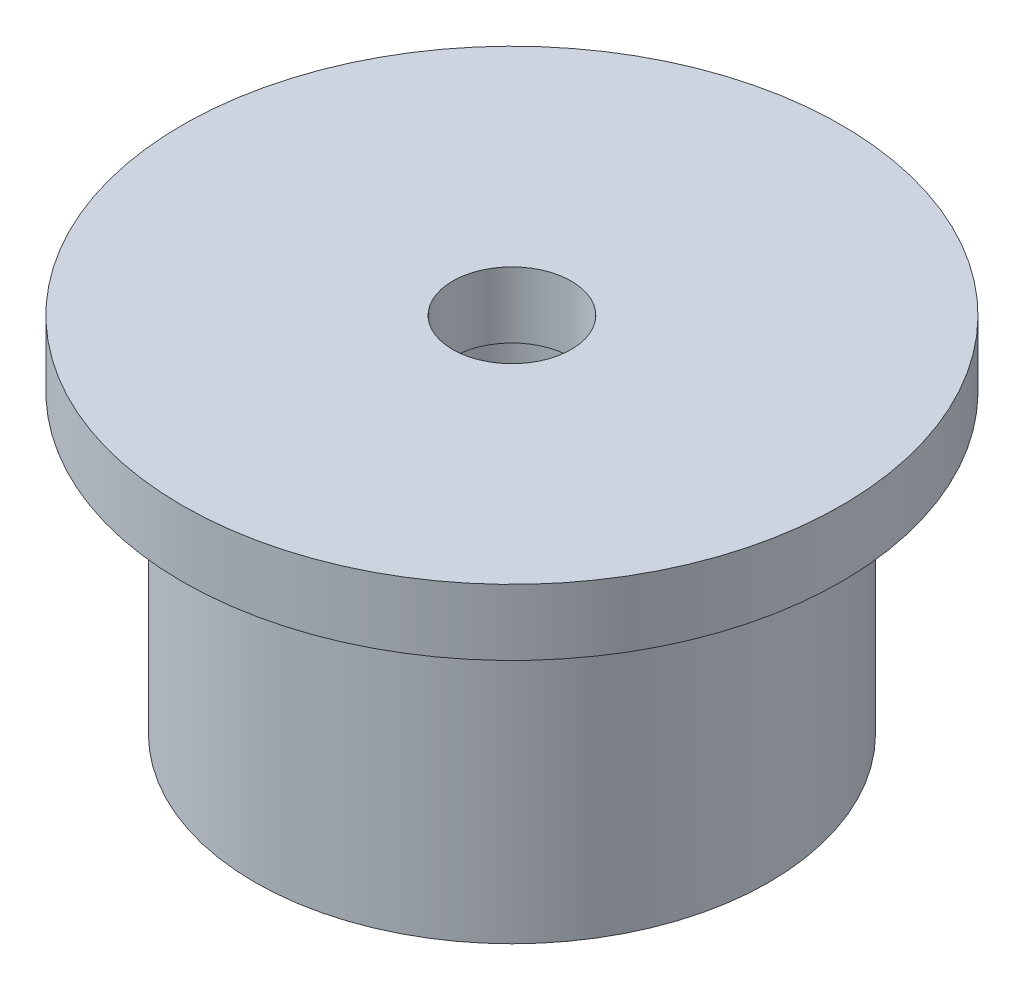
ISO-10303-21;
HEADER;
FILE_DESCRIPTION(('STEP AP214'),'2;1');
FILE_NAME('part.step','',(''),(''),'','','');
FILE_SCHEMA(('AUTOMOTIVE_DESIGN { 1 0 10303 214 1 1 1 1 }'));
ENDSEC;
DATA;
#1=APPLICATION_CONTEXT('core data for automotive mechanical design processes');
#2=APPLICATION_PROTOCOL_DEFINITION('international standard','automotive_design',2000,#1);
#3=PRODUCT_CONTEXT('',#1,'mechanical');
#4=PRODUCT('Part','Part','',(#3));
#5=PRODUCT_RELATED_PRODUCT_CATEGORY('part','',(#4));
#6=PRODUCT_DEFINITION_FORMATION('','',#4);
#7=PRODUCT_DEFINITION_CONTEXT('part definition',#1,'design');
#8=PRODUCT_DEFINITION('design','',#6,#7);
#9=PRODUCT_DEFINITION_SHAPE('','',#8);
#10=(LENGTH_UNIT() NAMED_UNIT(*) SI_UNIT(.MILLI.,.METRE.));
#11=(NAMED_UNIT(*) PLANE_ANGLE_UNIT() SI_UNIT($,.RADIAN.));
#12=(NAMED_UNIT(*) SI_UNIT($,.STERADIAN.) SOLID_ANGLE_UNIT());
#13=UNCERTAINTY_MEASURE_WITH_UNIT(LENGTH_MEASURE(1.E-05),#10,'distance_accuracy_value','');
#14=(GEOMETRIC_REPRESENTATION_CONTEXT(3) GLOBAL_UNCERTAINTY_ASSIGNED_CONTEXT((#13)) GLOBAL_UNIT_ASSIGNED_CONTEXT((#10,
#11,#12)) REPRESENTATION_CONTEXT('',''));
#15=CARTESIAN_POINT('',(0.,0.,0.));
#16=DIRECTION('',(0.,0.,1.));
#17=DIRECTION('',(1.,0.,0.));
#18=AXIS2_PLACEMENT_3D('',#15,#16,#17);
#19=CARTESIAN_POINT('',(0.,-0.5,0.));
#20=DIRECTION('',(0.,1.,0.));
#21=DIRECTION('',(0.,0.,1.));
#22=AXIS2_PLACEMENT_3D('',#19,#20,#21);
#23=PLANE('',#22);
#24=CARTESIAN_POINT('',(0.,-0.5,0.));
#25=DIRECTION('',(0.,1.,0.));
#26=DIRECTION('',(0.,0.,1.));
#27=AXIS2_PLACEMENT_3D('',#24,#25,#26);
#28=CIRCLE('',#27,5.);
#29=CARTESIAN_POINT('',(0.,-0.5,5.));
#30=VERTEX_POINT('',#29);
#31=EDGE_CURVE('E53',#30,#30,#28,.T.);
#32=ORIENTED_EDGE('',*,*,#31,.F.);
#33=EDGE_LOOP('',(#32));
#34=FACE_BOUND('',#33,.T.);
#35=CARTESIAN_POINT('',(0.,-0.5,0.));
#36=DIRECTION('',(0.,1.,0.));
#37=DIRECTION('',(0.,0.,1.));
#38=AXIS2_PLACEMENT_3D('',#35,#36,#37);
#39=CIRCLE('',#38,3.9);
#40=CARTESIAN_POINT('',(0.,-0.5,3.9));
#41=VERTEX_POINT('',#40);
#42=EDGE_CURVE('E46',#41,#41,#39,.F.);
#43=ORIENTED_EDGE('',*,*,#42,.F.);
#44=EDGE_LOOP('',(#43));
#45=FACE_BOUND('',#44,.T.);
#46=ADVANCED_FACE('F35',(#34,#45),#23,.F.);
#47=CARTESIAN_POINT('',(0.,0.5,0.));
#48=DIRECTION('',(0.,-1.,0.));
#49=DIRECTION('',(0.,0.,-1.));
#50=AXIS2_PLACEMENT_3D('',#47,#48,#49);
#51=CYLINDRICAL_SURFACE('',#50,5.);
#52=CARTESIAN_POINT('',(0.,0.5,0.));
#53=DIRECTION('',(0.,1.,0.));
#54=DIRECTION('',(0.,0.,1.));
#55=AXIS2_PLACEMENT_3D('',#52,#53,#54);
#56=CIRCLE('',#55,5.);
#57=CARTESIAN_POINT('',(0.,0.5,5.));
#58=VERTEX_POINT('',#57);
#59=EDGE_CURVE('E50',#58,#58,#56,.T.);
#60=ORIENTED_EDGE('',*,*,#59,.F.);
#61=EDGE_LOOP('',(#60));
#62=FACE_BOUND('',#61,.T.);
#63=ORIENTED_EDGE('',*,*,#31,.T.);
#64=EDGE_LOOP('',(#63));
#65=FACE_BOUND('',#64,.T.);
#66=ADVANCED_FACE('F77',(#62,#65),#51,.T.);
#67=CARTESIAN_POINT('',(0.,0.5,0.));
#68=DIRECTION('',(0.,1.,0.));
#69=DIRECTION('',(0.,0.,1.));
#70=AXIS2_PLACEMENT_3D('',#67,#68,#69);
#71=PLANE('',#70);
#72=CARTESIAN_POINT('',(0.,0.5,0.));
#73=DIRECTION('',(0.,1.,0.));
#74=DIRECTION('',(0.,0.,1.));
#75=AXIS2_PLACEMENT_3D('',#72,#73,#74);
#76=CIRCLE('',#75,0.9);
#77=CARTESIAN_POINT('',(0.,0.5,0.9));
#78=VERTEX_POINT('',#77);
#79=EDGE_CURVE('E64',#78,#78,#76,.T.);
#80=ORIENTED_EDGE('',*,*,#79,.F.);
#81=EDGE_LOOP('',(#80));
#82=FACE_BOUND('',#81,.T.);
#83=ORIENTED_EDGE('',*,*,#59,.T.);
#84=EDGE_LOOP('',(#83));
#85=FACE_BOUND('',#84,.T.);
#86=ADVANCED_FACE('F73',(#82,#85),#71,.T.);
#87=CARTESIAN_POINT('',(0.,-5.,0.));
#88=DIRECTION('',(0.,1.,0.));
#89=DIRECTION('',(0.,0.,1.));
#90=AXIS2_PLACEMENT_3D('',#87,#88,#89);
#91=CYLINDRICAL_SURFACE('',#90,3.9);
#92=CARTESIAN_POINT('',(0.,-5.,0.));
#93=DIRECTION('',(0.,-1.,0.));
#94=DIRECTION('',(0.,0.,-1.));
#95=AXIS2_PLACEMENT_3D('',#92,#93,#94);
#96=CIRCLE('',#95,3.9);
#97=CARTESIAN_POINT('',(0.,-5.,-3.9));
#98=VERTEX_POINT('',#97);
#99=EDGE_CURVE('E56',#98,#98,#96,.T.);
#100=ORIENTED_EDGE('',*,*,#99,.F.);
#101=EDGE_LOOP('',(#100));
#102=FACE_BOUND('',#101,.T.);
#103=ORIENTED_EDGE('',*,*,#42,.T.);
#104=EDGE_LOOP('',(#103));
#105=FACE_BOUND('',#104,.T.);
#106=ADVANCED_FACE('F76',(#102,#105),#91,.T.);
#107=CARTESIAN_POINT('',(0.,-5.,0.));
#108=DIRECTION('',(0.,-1.,0.));
#109=DIRECTION('',(0.,0.,-1.));
#110=AXIS2_PLACEMENT_3D('',#107,#108,#109);
#111=PLANE('',#110);
#112=CARTESIAN_POINT('',(0.,-5.,0.));
#113=DIRECTION('',(0.,-1.,0.));
#114=DIRECTION('',(0.,0.,-1.));
#115=AXIS2_PLACEMENT_3D('',#112,#113,#114);
#116=CIRCLE('',#115,1.2);
#117=CARTESIAN_POINT('',(0.,-5.,-1.2));
#118=VERTEX_POINT('',#117);
#119=EDGE_CURVE('E10',#118,#118,#116,.F.);
#120=ORIENTED_EDGE('',*,*,#119,.T.);
#121=EDGE_LOOP('',(#120));
#122=FACE_BOUND('',#121,.T.);
#123=ORIENTED_EDGE('',*,*,#99,.T.);
#124=EDGE_LOOP('',(#123));
#125=FACE_BOUND('',#124,.T.);
#126=ADVANCED_FACE('F91',(#122,#125),#111,.T.);
#127=CARTESIAN_POINT('',(0.,-0.5,0.));
#128=DIRECTION('',(0.,-1.,0.));
#129=DIRECTION('',(0.,0.,-1.));
#130=AXIS2_PLACEMENT_3D('',#127,#128,#129);
#131=CYLINDRICAL_SURFACE('',#130,1.);
#132=CARTESIAN_POINT('',(0.,-4.8,0.));
#133=DIRECTION('',(0.,-1.,0.));
#134=DIRECTION('',(0.,0.,-1.));
#135=AXIS2_PLACEMENT_3D('',#132,#133,#134);
#136=CIRCLE('',#135,1.);
#137=CARTESIAN_POINT('',(0.,-4.8,-1.));
#138=VERTEX_POINT('',#137);
#139=EDGE_CURVE('E42',#138,#138,#136,.T.);
#140=ORIENTED_EDGE('',*,*,#139,.T.);
#141=EDGE_LOOP('',(#140));
#142=FACE_BOUND('',#141,.T.);
#143=CARTESIAN_POINT('',(0.,-0.5,0.));
#144=DIRECTION('',(0.,-1.,0.));
#145=DIRECTION('',(0.,0.,-1.));
#146=AXIS2_PLACEMENT_3D('',#143,#144,#145);
#147=CIRCLE('',#146,1.);
#148=CARTESIAN_POINT('',(0.,-0.5,-1.));
#149=VERTEX_POINT('',#148);
#150=EDGE_CURVE('E61',#149,#149,#147,.T.);
#151=ORIENTED_EDGE('',*,*,#150,.F.);
#152=EDGE_LOOP('',(#151));
#153=FACE_BOUND('',#152,.T.);
#154=ADVANCED_FACE('F97',(#142,#153),#131,.F.);
#155=CARTESIAN_POINT('',(0.,-0.5,0.));
#156=DIRECTION('',(0.,-1.,0.));
#157=DIRECTION('',(0.,0.,-1.));
#158=AXIS2_PLACEMENT_3D('',#155,#156,#157);
#159=PLANE('',#158);
#160=CARTESIAN_POINT('',(0.,-0.5,0.));
#161=DIRECTION('',(0.,-1.,0.));
#162=DIRECTION('',(0.,0.,-1.));
#163=AXIS2_PLACEMENT_3D('',#160,#161,#162);
#164=CIRCLE('',#163,0.9);
#165=CARTESIAN_POINT('',(0.,-0.5,0.9));
#166=VERTEX_POINT('',#165);
#167=EDGE_CURVE('E65',#166,#166,#164,.F.);
#168=ORIENTED_EDGE('',*,*,#167,.T.);
#169=EDGE_LOOP('',(#168));
#170=FACE_BOUND('',#169,.T.);
#171=ORIENTED_EDGE('',*,*,#150,.T.);
#172=EDGE_LOOP('',(#171));
#173=FACE_BOUND('',#172,.T.);
#174=ADVANCED_FACE('F103',(#170,#173),#159,.T.);
#175=CARTESIAN_POINT('',(0.,-5.001,0.));
#176=DIRECTION('',(0.,1.,0.));
#177=DIRECTION('',(0.,0.,1.));
#178=AXIS2_PLACEMENT_3D('',#175,#176,#177);
#179=CYLINDRICAL_SURFACE('',#178,0.9);
#180=CARTESIAN_POINT('',(0.,-0.5,0.9));
#181=CARTESIAN_POINT('',(0.,-0.489583333333333,0.9));
#182=CARTESIAN_POINT('',(0.,-0.479166666666666,0.9));
#183=CARTESIAN_POINT('',(0.,-0.458333333333333,0.9));
#184=CARTESIAN_POINT('',(0.,-0.447916666666666,0.9));
#185=CARTESIAN_POINT('',(0.,-0.427083333333333,0.9));
#186=CARTESIAN_POINT('',(0.,-0.416666666666666,0.9));
#187=CARTESIAN_POINT('',(0.,-0.395833333333333,0.9));
#188=CARTESIAN_POINT('',(0.,-0.385416666666666,0.9));
#189=CARTESIAN_POINT('',(0.,-0.364583333333333,0.9));
#190=CARTESIAN_POINT('',(0.,-0.354166666666666,0.9));
#191=CARTESIAN_POINT('',(0.,-0.333333333333333,0.9));
#192=CARTESIAN_POINT('',(0.,-0.322916666666666,0.9));
#193=CARTESIAN_POINT('',(0.,-0.302083333333333,0.9));
#194=CARTESIAN_POINT('',(0.,-0.291666666666666,0.9));
#195=CARTESIAN_POINT('',(0.,-0.270833333333333,0.9));
#196=CARTESIAN_POINT('',(0.,-0.260416666666666,0.9));
#197=CARTESIAN_POINT('',(0.,-0.239583333333333,0.9));
#198=CARTESIAN_POINT('',(0.,-0.229166666666667,0.9));
#199=CARTESIAN_POINT('',(0.,-0.208333333333334,0.9));
#200=CARTESIAN_POINT('',(0.,-0.197916666666667,0.9));
#201=CARTESIAN_POINT('',(0.,-0.177083333333333,0.9));
#202=CARTESIAN_POINT('',(0.,-0.166666666666667,0.9));
#203=CARTESIAN_POINT('',(0.,-0.145833333333333,0.9));
#204=CARTESIAN_POINT('',(0.,-0.135416666666667,0.9));
#205=CARTESIAN_POINT('',(0.,-0.114583333333333,0.9));
#206=CARTESIAN_POINT('',(0.,-0.104166666666667,0.9));
#207=CARTESIAN_POINT('',(0.,-0.0833333333333334,0.9));
#208=CARTESIAN_POINT('',(0.,-0.0729166666666667,0.9));
#209=CARTESIAN_POINT('',(0.,-0.0520833333333334,0.9));
#210=CARTESIAN_POINT('',(0.,-0.0416666666666667,0.9));
#211=CARTESIAN_POINT('',(0.,-0.0208333333333334,0.9));
#212=CARTESIAN_POINT('',(0.,-0.0104166666666667,0.9));
#213=CARTESIAN_POINT('',(0.,0.0104166666666667,0.9));
#214=CARTESIAN_POINT('',(0.,0.0208333333333334,0.9));
#215=CARTESIAN_POINT('',(0.,0.0416666666666667,0.9));
#216=CARTESIAN_POINT('',(0.,0.0520833333333334,0.9));
#217=CARTESIAN_POINT('',(0.,0.0729166666666667,0.9));
#218=CARTESIAN_POINT('',(0.,0.0833333333333334,0.9));
#219=CARTESIAN_POINT('',(0.,0.104166666666667,0.9));
#220=CARTESIAN_POINT('',(0.,0.114583333333333,0.9));
#221=CARTESIAN_POINT('',(0.,0.135416666666667,0.9));
#222=CARTESIAN_POINT('',(0.,0.145833333333333,0.9));
#223=CARTESIAN_POINT('',(0.,0.166666666666667,0.9));
#224=CARTESIAN_POINT('',(0.,0.177083333333333,0.9));
#225=CARTESIAN_POINT('',(0.,0.197916666666667,0.9));
#226=CARTESIAN_POINT('',(0.,0.208333333333333,0.9));
#227=CARTESIAN_POINT('',(0.,0.229166666666666,0.9));
#228=CARTESIAN_POINT('',(0.,0.239583333333333,0.9));
#229=CARTESIAN_POINT('',(0.,0.260416666666666,0.9));
#230=CARTESIAN_POINT('',(0.,0.270833333333333,0.9));
#231=CARTESIAN_POINT('',(0.,0.291666666666666,0.9));
#232=CARTESIAN_POINT('',(0.,0.302083333333333,0.9));
#233=CARTESIAN_POINT('',(0.,0.322916666666666,0.9));
#234=CARTESIAN_POINT('',(0.,0.333333333333333,0.9));
#235=CARTESIAN_POINT('',(0.,0.354166666666666,0.9));
#236=CARTESIAN_POINT('',(0.,0.364583333333333,0.9));
#237=CARTESIAN_POINT('',(0.,0.385416666666666,0.9));
#238=CARTESIAN_POINT('',(0.,0.395833333333333,0.9));
#239=CARTESIAN_POINT('',(0.,0.416666666666666,0.9));
#240=CARTESIAN_POINT('',(0.,0.427083333333333,0.9));
#241=CARTESIAN_POINT('',(0.,0.447916666666666,0.9));
#242=CARTESIAN_POINT('',(0.,0.458333333333333,0.9));
#243=CARTESIAN_POINT('',(0.,0.479166666666666,0.9));
#244=CARTESIAN_POINT('',(0.,0.489583333333333,0.9));
#245=CARTESIAN_POINT('',(0.,0.5,0.9));
#246=B_SPLINE_CURVE_WITH_KNOTS('',3,(#180,#181,#182,#183,#184,#185,#186,#187,#188,#189,#190,
#191,#192,#193,#194,#195,#196,#197,#198,#199,#200,#201,#202,#203,#204,#205,#206,#207,#208,#209,
#210,#211,#212,#213,#214,#215,#216,#217,#218,#219,#220,#221,#222,#223,#224,#225,#226,#227,#228,
#229,#230,#231,#232,#233,#234,#235,#236,#237,#238,#239,#240,#241,#242,#243,#244,#245),
.UNSPECIFIED.,.F.,.F.,(4,2,2,2,2,2,2,2,2,2,2,2,2,2,2,2,2,2,2,2,2,2,2,2,2,2,2,2,2,2,2,2,4),(0.,
0.03125,0.0625000000000001,0.0937500000000001,0.125,0.15625,0.1875,0.21875,0.25,
0.281249999999999,0.312499999999999,0.343749999999999,0.374999999999999,0.40625,0.4375,0.46875,
0.5,0.53125,0.5625,0.59375,0.625,0.65625,0.6875,0.718749999999999,0.749999999999999,
0.781249999999999,0.812499999999999,0.843749999999999,0.874999999999999,0.906249999999999,
0.937499999999999,0.968749999999999,0.999999999999999),.UNSPECIFIED.);
#247=EDGE_CURVE('BSEAM71',#166,#78,#246,.T.);
#248=ORIENTED_EDGE('',*,*,#167,.F.);
#249=ORIENTED_EDGE('',*,*,#79,.T.);
#250=ORIENTED_EDGE('',*,*,#247,.T.);
#251=ORIENTED_EDGE('',*,*,#247,.F.);
#252=EDGE_LOOP('',(#248,#250,#249,#251));
#253=FACE_BOUND('',#252,.T.);
#254=ADVANCED_FACE('F71',(#253),#179,.F.);
#255=CARTESIAN_POINT('',(0.,-4.8,0.));
#256=DIRECTION('',(0.,-1.,0.));
#257=DIRECTION('',(0.,0.,-1.));
#258=AXIS2_PLACEMENT_3D('',#255,#256,#257);
#259=CONICAL_SURFACE('',#258,1.,0.785398163397453);
#260=ORIENTED_EDGE('',*,*,#119,.F.);
#261=EDGE_LOOP('',(#260));
#262=FACE_BOUND('',#261,.T.);
#263=ORIENTED_EDGE('',*,*,#139,.F.);
#264=EDGE_LOOP('',(#263));
#265=FACE_BOUND('',#264,.T.);
#266=ADVANCED_FACE('F37',(#262,#265),#259,.F.);
#267=CLOSED_SHELL('',(#46,#66,#86,#106,#126,#154,#174,#254,#266));
#268=MANIFOLD_SOLID_BREP('B2',#267);
#269=ADVANCED_BREP_SHAPE_REPRESENTATION('',(#18,#268),#14);
#270=SHAPE_DEFINITION_REPRESENTATION(#9,#269);
ENDSEC;
END-ISO-10303-21;
